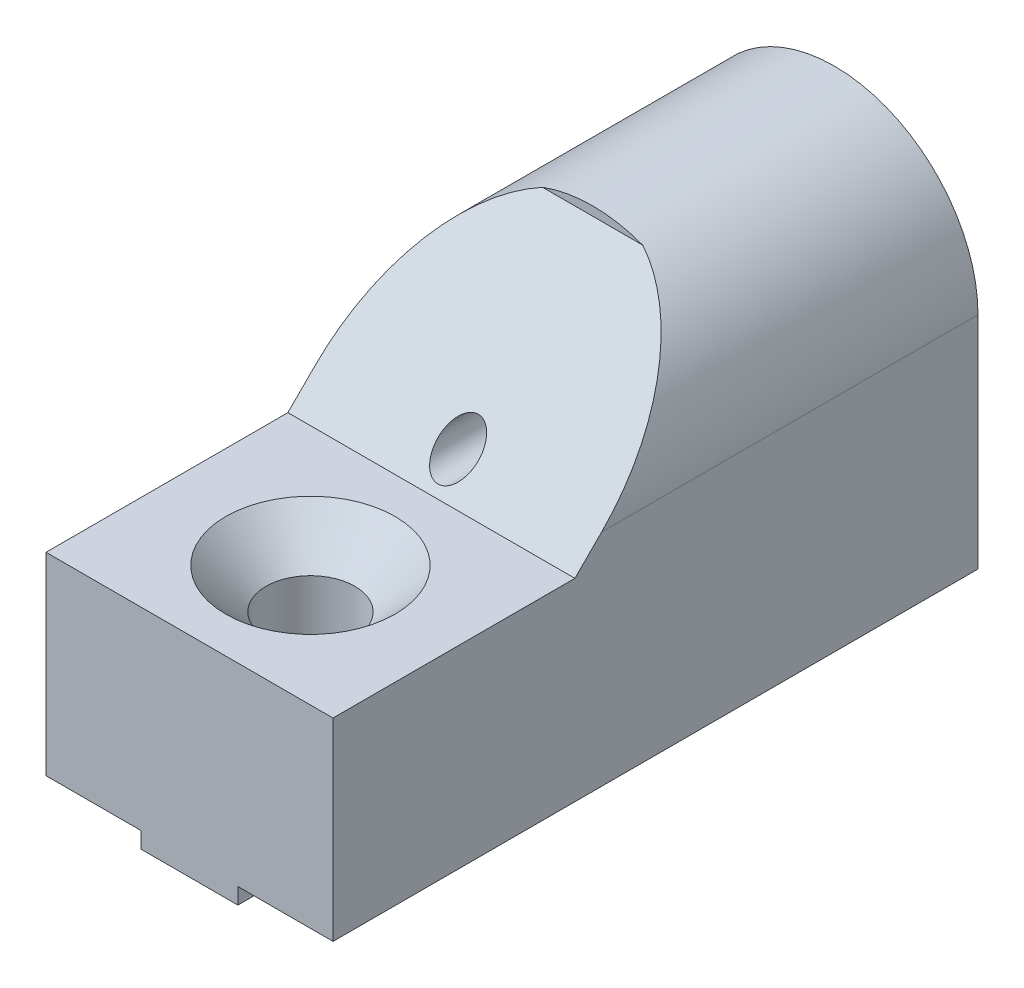
ISO-10303-21;
HEADER;
FILE_DESCRIPTION(('STEP AP214'),'2;1');
FILE_NAME('part.step','',(''),(''),'','','');
FILE_SCHEMA(('AUTOMOTIVE_DESIGN { 1 0 10303 214 1 1 1 1 }'));
ENDSEC;
DATA;
#1=APPLICATION_CONTEXT('core data for automotive mechanical design processes');
#2=APPLICATION_PROTOCOL_DEFINITION('international standard','automotive_design',2000,#1);
#3=PRODUCT_CONTEXT('',#1,'mechanical');
#4=PRODUCT('Part','Part','',(#3));
#5=PRODUCT_RELATED_PRODUCT_CATEGORY('part','',(#4));
#6=PRODUCT_DEFINITION_FORMATION('','',#4);
#7=PRODUCT_DEFINITION_CONTEXT('part definition',#1,'design');
#8=PRODUCT_DEFINITION('design','',#6,#7);
#9=PRODUCT_DEFINITION_SHAPE('','',#8);
#10=(LENGTH_UNIT() NAMED_UNIT(*) SI_UNIT(.MILLI.,.METRE.));
#11=(NAMED_UNIT(*) PLANE_ANGLE_UNIT() SI_UNIT($,.RADIAN.));
#12=(NAMED_UNIT(*) SI_UNIT($,.STERADIAN.) SOLID_ANGLE_UNIT());
#13=UNCERTAINTY_MEASURE_WITH_UNIT(LENGTH_MEASURE(1.E-05),#10,'distance_accuracy_value','');
#14=(GEOMETRIC_REPRESENTATION_CONTEXT(3) GLOBAL_UNCERTAINTY_ASSIGNED_CONTEXT((#13)) GLOBAL_UNIT_ASSIGNED_CONTEXT((#10,
#11,#12)) REPRESENTATION_CONTEXT('',''));
#15=CARTESIAN_POINT('',(0.,0.,0.));
#16=DIRECTION('',(0.,0.,1.));
#17=DIRECTION('',(1.,0.,0.));
#18=AXIS2_PLACEMENT_3D('',#15,#16,#17);
#19=CARTESIAN_POINT('',(-8.9,-13.66,15.));
#20=DIRECTION('',(0.,1.,0.));
#21=DIRECTION('',(0.,0.,1.));
#22=AXIS2_PLACEMENT_3D('',#19,#20,#21);
#23=PLANE('',#22);
#24=DIRECTION('',(0.,0.,1.));
#25=VECTOR('',#24,1.);
#26=CARTESIAN_POINT('',(3.,-13.66,40.));
#27=LINE('',#26,#25);
#28=CARTESIAN_POINT('',(3.,-13.66,0.));
#29=VERTEX_POINT('',#28);
#30=CARTESIAN_POINT('',(3.,-13.66,40.));
#31=VERTEX_POINT('',#30);
#32=EDGE_CURVE('E152',#29,#31,#27,.T.);
#33=ORIENTED_EDGE('',*,*,#32,.F.);
#34=DIRECTION('',(1.,0.,0.));
#35=VECTOR('',#34,1.);
#36=CARTESIAN_POINT('',(-8.9,-13.66,0.));
#37=LINE('',#36,#35);
#38=CARTESIAN_POINT('',(8.9,-13.66,0.));
#39=VERTEX_POINT('',#38);
#40=EDGE_CURVE('E195',#29,#39,#37,.T.);
#41=ORIENTED_EDGE('',*,*,#40,.T.);
#42=DIRECTION('',(0.,0.,-1.));
#43=VECTOR('',#42,1.);
#44=CARTESIAN_POINT('',(8.9,-13.66,15.));
#45=LINE('',#44,#43);
#46=CARTESIAN_POINT('',(8.9,-13.66,40.));
#47=VERTEX_POINT('',#46);
#48=EDGE_CURVE('E211',#47,#39,#45,.T.);
#49=ORIENTED_EDGE('',*,*,#48,.F.);
#50=DIRECTION('',(1.,0.,0.));
#51=VECTOR('',#50,1.);
#52=CARTESIAN_POINT('',(-8.9,-13.66,40.));
#53=LINE('',#52,#51);
#54=EDGE_CURVE('E58',#31,#47,#53,.T.);
#55=ORIENTED_EDGE('',*,*,#54,.F.);
#56=EDGE_LOOP('',(#33,#41,#49,#55));
#57=FACE_BOUND('',#56,.T.);
#58=ADVANCED_FACE('F41',(#57),#23,.F.);
#59=DIRECTION('',(0.,0.,-1.));
#60=VECTOR('',#59,1.);
#61=CARTESIAN_POINT('',(-3.,-13.66,40.));
#62=LINE('',#61,#60);
#63=CARTESIAN_POINT('',(-3.,-13.66,40.));
#64=VERTEX_POINT('',#63);
#65=CARTESIAN_POINT('',(-3.,-13.66,0.));
#66=VERTEX_POINT('',#65);
#67=EDGE_CURVE('E66',#64,#66,#62,.T.);
#68=ORIENTED_EDGE('',*,*,#67,.F.);
#69=CARTESIAN_POINT('',(-8.9,-13.66,40.));
#70=VERTEX_POINT('',#69);
#71=EDGE_CURVE('E163',#70,#64,#53,.T.);
#72=ORIENTED_EDGE('',*,*,#71,.F.);
#73=DIRECTION('',(0.,0.,-1.));
#74=VECTOR('',#73,1.);
#75=CARTESIAN_POINT('',(-8.9,-13.66,15.));
#76=LINE('',#75,#74);
#77=CARTESIAN_POINT('',(-8.9,-13.66,0.));
#78=VERTEX_POINT('',#77);
#79=EDGE_CURVE('E215',#70,#78,#76,.T.);
#80=ORIENTED_EDGE('',*,*,#79,.T.);
#81=EDGE_CURVE('E196',#78,#66,#37,.T.);
#82=ORIENTED_EDGE('',*,*,#81,.T.);
#83=EDGE_LOOP('',(#68,#72,#80,#82));
#84=FACE_BOUND('',#83,.T.);
#85=ADVANCED_FACE('F260',(#84),#23,.F.);
#86=CARTESIAN_POINT('',(0.,0.,15.));
#87=DIRECTION('',(0.,0.,-1.));
#88=DIRECTION('',(-1.,0.,0.));
#89=AXIS2_PLACEMENT_3D('',#86,#87,#88);
#90=PLANE('',#89);
#91=CARTESIAN_POINT('',(0.,0.,15.));
#92=DIRECTION('',(0.,0.,1.));
#93=DIRECTION('',(-1.,0.,0.));
#94=AXIS2_PLACEMENT_3D('',#91,#92,#93);
#95=CIRCLE('',#94,8.9);
#96=CARTESIAN_POINT('',(3.10715303775024,8.33999999999997,15.));
#97=VERTEX_POINT('',#96);
#98=CARTESIAN_POINT('',(-3.10715303775024,8.33999999999997,15.));
#99=VERTEX_POINT('',#98);
#100=EDGE_CURVE('E185',#97,#99,#95,.T.);
#101=ORIENTED_EDGE('',*,*,#100,.T.);
#102=DIRECTION('',(1.,0.,0.));
#103=VECTOR('',#102,1.);
#104=CARTESIAN_POINT('',(8.9,8.33999999999997,15.));
#105=LINE('',#104,#103);
#106=EDGE_CURVE('E223',#99,#97,#105,.T.);
#107=ORIENTED_EDGE('',*,*,#106,.T.);
#108=EDGE_LOOP('',(#101,#107));
#109=FACE_BOUND('',#108,.T.);
#110=ADVANCED_FACE('F265',(#109),#90,.F.);
#111=CARTESIAN_POINT('',(0.,0.,0.));
#112=DIRECTION('',(0.,0.,-1.));
#113=DIRECTION('',(-1.,0.,0.));
#114=AXIS2_PLACEMENT_3D('',#111,#112,#113);
#115=PLANE('',#114);
#116=DIRECTION('',(0.,-1.,0.));
#117=VECTOR('',#116,1.);
#118=CARTESIAN_POINT('',(-8.9,-13.66,0.));
#119=LINE('',#118,#117);
#120=CARTESIAN_POINT('',(-8.9,0.,0.));
#121=VERTEX_POINT('',#120);
#122=EDGE_CURVE('E191',#121,#78,#119,.T.);
#123=ORIENTED_EDGE('',*,*,#122,.F.);
#124=CARTESIAN_POINT('',(0.,0.,0.));
#125=DIRECTION('',(0.,0.,1.));
#126=DIRECTION('',(-1.,0.,0.));
#127=AXIS2_PLACEMENT_3D('',#124,#125,#126);
#128=CIRCLE('',#127,8.9);
#129=CARTESIAN_POINT('',(8.9,0.,0.));
#130=VERTEX_POINT('',#129);
#131=EDGE_CURVE('E190',#130,#121,#128,.T.);
#132=ORIENTED_EDGE('',*,*,#131,.F.);
#133=DIRECTION('',(0.,1.,0.));
#134=VECTOR('',#133,1.);
#135=CARTESIAN_POINT('',(8.9,0.,0.));
#136=LINE('',#135,#134);
#137=EDGE_CURVE('E199',#39,#130,#136,.T.);
#138=ORIENTED_EDGE('',*,*,#137,.F.);
#139=ORIENTED_EDGE('',*,*,#40,.F.);
#140=DIRECTION('',(0.,1.,0.));
#141=VECTOR('',#140,1.);
#142=CARTESIAN_POINT('',(3.,-14.66,0.));
#143=LINE('',#142,#141);
#144=CARTESIAN_POINT('',(3.,-14.66,0.));
#145=VERTEX_POINT('',#144);
#146=EDGE_CURVE('E326',#145,#29,#143,.T.);
#147=ORIENTED_EDGE('',*,*,#146,.F.);
#148=DIRECTION('',(1.,0.,0.));
#149=VECTOR('',#148,1.);
#150=CARTESIAN_POINT('',(3.,-14.66,0.));
#151=LINE('',#150,#149);
#152=CARTESIAN_POINT('',(-3.,-14.66,0.));
#153=VERTEX_POINT('',#152);
#154=EDGE_CURVE('E145',#153,#145,#151,.T.);
#155=ORIENTED_EDGE('',*,*,#154,.F.);
#156=DIRECTION('',(0.,1.,0.));
#157=VECTOR('',#156,1.);
#158=CARTESIAN_POINT('',(-3.,-14.66,0.));
#159=LINE('',#158,#157);
#160=EDGE_CURVE('E159',#153,#66,#159,.T.);
#161=ORIENTED_EDGE('',*,*,#160,.T.);
#162=ORIENTED_EDGE('',*,*,#81,.F.);
#163=EDGE_LOOP('',(#123,#132,#138,#139,#147,#155,#161,#162));
#164=FACE_BOUND('',#163,.T.);
#165=CARTESIAN_POINT('',(0.,0.,0.));
#166=DIRECTION('',(0.,0.,1.));
#167=DIRECTION('',(1.,0.,0.));
#168=AXIS2_PLACEMENT_3D('',#165,#166,#167);
#169=CIRCLE('',#168,1.25);
#170=CARTESIAN_POINT('',(1.25,0.,0.));
#171=VERTEX_POINT('',#170);
#172=EDGE_CURVE('E180',#171,#171,#169,.T.);
#173=ORIENTED_EDGE('',*,*,#172,.T.);
#174=EDGE_LOOP('',(#173));
#175=FACE_BOUND('',#174,.T.);
#176=ADVANCED_FACE('F272',(#164,#175),#115,.T.);
#177=CARTESIAN_POINT('',(-8.9,-13.66,15.));
#178=DIRECTION('',(1.,0.,0.));
#179=DIRECTION('',(0.,0.,-1.));
#180=AXIS2_PLACEMENT_3D('',#177,#178,#179);
#181=PLANE('',#180);
#182=ORIENTED_EDGE('',*,*,#122,.T.);
#183=ORIENTED_EDGE('',*,*,#79,.F.);
#184=DIRECTION('',(0.,-1.,0.));
#185=VECTOR('',#184,1.);
#186=CARTESIAN_POINT('',(-8.9,-13.66,40.));
#187=LINE('',#186,#185);
#188=CARTESIAN_POINT('',(-8.9,-1.66,40.));
#189=VERTEX_POINT('',#188);
#190=EDGE_CURVE('E154',#189,#70,#187,.T.);
#191=ORIENTED_EDGE('',*,*,#190,.F.);
#192=DIRECTION('',(0.,0.,-1.));
#193=VECTOR('',#192,1.);
#194=CARTESIAN_POINT('',(-8.9,-1.66,40.));
#195=LINE('',#194,#193);
#196=CARTESIAN_POINT('',(-8.9,-1.66,25.0000000000001));
#197=VERTEX_POINT('',#196);
#198=EDGE_CURVE('E172',#189,#197,#195,.T.);
#199=ORIENTED_EDGE('',*,*,#198,.T.);
#200=DIRECTION('',(0.,-0.707106781186544,0.707106781186551));
#201=VECTOR('',#200,1.);
#202=CARTESIAN_POINT('',(-8.9,-2.6599999999999,26.));
#203=LINE('',#202,#201);
#204=CARTESIAN_POINT('',(-8.9,0.,23.3400000000001));
#205=VERTEX_POINT('',#204);
#206=EDGE_CURVE('E226',#197,#205,#203,.F.);
#207=ORIENTED_EDGE('',*,*,#206,.T.);
#208=DIRECTION('',(0.,0.,-1.));
#209=VECTOR('',#208,1.);
#210=CARTESIAN_POINT('',(-8.9,0.,15.));
#211=LINE('',#210,#209);
#212=EDGE_CURVE('E189',#205,#121,#211,.T.);
#213=ORIENTED_EDGE('',*,*,#212,.T.);
#214=EDGE_LOOP('',(#182,#183,#191,#199,#207,#213));
#215=FACE_BOUND('',#214,.T.);
#216=ADVANCED_FACE('F270',(#215),#181,.F.);
#217=CARTESIAN_POINT('',(8.9,0.,15.));
#218=DIRECTION('',(-1.,0.,0.));
#219=DIRECTION('',(0.,-1.,0.));
#220=AXIS2_PLACEMENT_3D('',#217,#218,#219);
#221=PLANE('',#220);
#222=ORIENTED_EDGE('',*,*,#137,.T.);
#223=DIRECTION('',(0.,0.,-1.));
#224=VECTOR('',#223,1.);
#225=CARTESIAN_POINT('',(8.9,0.,15.));
#226=LINE('',#225,#224);
#227=CARTESIAN_POINT('',(8.9,0.,23.3400000000001));
#228=VERTEX_POINT('',#227);
#229=EDGE_CURVE('E207',#228,#130,#226,.T.);
#230=ORIENTED_EDGE('',*,*,#229,.F.);
#231=DIRECTION('',(0.,0.707106781186544,-0.707106781186551));
#232=VECTOR('',#231,1.);
#233=CARTESIAN_POINT('',(8.9,4.17000000000003,19.17));
#234=LINE('',#233,#232);
#235=CARTESIAN_POINT('',(8.9,-1.66,25.0000000000001));
#236=VERTEX_POINT('',#235);
#237=EDGE_CURVE('E237',#228,#236,#234,.F.);
#238=ORIENTED_EDGE('',*,*,#237,.T.);
#239=DIRECTION('',(0.,0.,-1.));
#240=VECTOR('',#239,1.);
#241=CARTESIAN_POINT('',(8.9,-1.66,40.));
#242=LINE('',#241,#240);
#243=CARTESIAN_POINT('',(8.9,-1.66,40.));
#244=VERTEX_POINT('',#243);
#245=EDGE_CURVE('E176',#244,#236,#242,.T.);
#246=ORIENTED_EDGE('',*,*,#245,.F.);
#247=DIRECTION('',(0.,1.,0.));
#248=VECTOR('',#247,1.);
#249=CARTESIAN_POINT('',(8.9,-13.66,40.));
#250=LINE('',#249,#248);
#251=EDGE_CURVE('E166',#47,#244,#250,.T.);
#252=ORIENTED_EDGE('',*,*,#251,.F.);
#253=ORIENTED_EDGE('',*,*,#48,.T.);
#254=EDGE_LOOP('',(#222,#230,#238,#246,#252,#253));
#255=FACE_BOUND('',#254,.T.);
#256=ADVANCED_FACE('F268',(#255),#221,.F.);
#257=CARTESIAN_POINT('',(0.,0.,15.));
#258=DIRECTION('',(0.,0.,-1.));
#259=DIRECTION('',(-1.,0.,0.));
#260=AXIS2_PLACEMENT_3D('',#257,#258,#259);
#261=CYLINDRICAL_SURFACE('',#260,8.9);
#262=ORIENTED_EDGE('',*,*,#131,.T.);
#263=ORIENTED_EDGE('',*,*,#212,.F.);
#264=CARTESIAN_POINT('',(0.,0.,23.3400000000001));
#265=DIRECTION('',(0.,0.707106781186551,0.707106781186544));
#266=DIRECTION('',(0.,0.707106781186544,-0.707106781186551));
#267=AXIS2_PLACEMENT_3D('',#264,#265,#266);
#268=ELLIPSE('',#267,12.5865007051206,8.9);
#269=EDGE_CURVE('E230',#205,#99,#268,.F.);
#270=ORIENTED_EDGE('',*,*,#269,.T.);
#271=ORIENTED_EDGE('',*,*,#100,.F.);
#272=CARTESIAN_POINT('',(0.,0.,23.3400000000001));
#273=DIRECTION('',(0.,0.707106781186551,0.707106781186544));
#274=DIRECTION('',(0.,0.707106781186544,-0.707106781186551));
#275=AXIS2_PLACEMENT_3D('',#272,#273,#274);
#276=ELLIPSE('',#275,12.5865007051206,8.9);
#277=EDGE_CURVE('E233',#97,#228,#276,.F.);
#278=ORIENTED_EDGE('',*,*,#277,.T.);
#279=ORIENTED_EDGE('',*,*,#229,.T.);
#280=EDGE_LOOP('',(#262,#263,#270,#271,#278,#279));
#281=FACE_BOUND('',#280,.T.);
#282=ADVANCED_FACE('F293',(#281),#261,.T.);
#283=CARTESIAN_POINT('',(0.,0.,15.));
#284=DIRECTION('',(0.,0.,-1.));
#285=DIRECTION('',(-1.,0.,0.));
#286=AXIS2_PLACEMENT_3D('',#283,#284,#285);
#287=CYLINDRICAL_SURFACE('',#286,1.25);
#288=CARTESIAN_POINT('',(0.,0.,23.3400000000001));
#289=DIRECTION('',(0.,0.707106781186551,0.707106781186544));
#290=DIRECTION('',(0.,0.707106781186544,-0.707106781186551));
#291=AXIS2_PLACEMENT_3D('',#288,#289,#290);
#292=ELLIPSE('',#291,1.76776695296638,1.25);
#293=CARTESIAN_POINT('',(0.,1.25,22.09));
#294=VERTEX_POINT('',#293);
#295=EDGE_CURVE('E184',#294,#294,#292,.T.);
#296=ORIENTED_EDGE('',*,*,#295,.T.);
#297=EDGE_LOOP('',(#296));
#298=FACE_BOUND('',#297,.T.);
#299=ORIENTED_EDGE('',*,*,#172,.F.);
#300=EDGE_LOOP('',(#299));
#301=FACE_BOUND('',#300,.T.);
#302=ADVANCED_FACE('F290',(#298,#301),#287,.F.);
#303=CARTESIAN_POINT('',(-8.9,-1.66,40.));
#304=DIRECTION('',(0.,-1.,0.));
#305=DIRECTION('',(0.,0.,-1.));
#306=AXIS2_PLACEMENT_3D('',#303,#304,#305);
#307=PLANE('',#306);
#308=CARTESIAN_POINT('',(0.,-1.66,32.5000000000001));
#309=DIRECTION('',(0.,-1.,0.));
#310=DIRECTION('',(0.,0.,-1.));
#311=AXIS2_PLACEMENT_3D('',#308,#309,#310);
#312=CIRCLE('',#311,5.25000000000002);
#313=CARTESIAN_POINT('',(0.,-1.66,27.2500000000001));
#314=VERTEX_POINT('',#313);
#315=EDGE_CURVE('E11',#314,#314,#312,.T.);
#316=ORIENTED_EDGE('',*,*,#315,.T.);
#317=EDGE_LOOP('',(#316));
#318=FACE_BOUND('',#317,.T.);
#319=ORIENTED_EDGE('',*,*,#245,.T.);
#320=DIRECTION('',(-1.,0.,0.));
#321=VECTOR('',#320,1.);
#322=CARTESIAN_POINT('',(-8.9,-1.66,25.0000000000001));
#323=LINE('',#322,#321);
#324=EDGE_CURVE('E219',#236,#197,#323,.T.);
#325=ORIENTED_EDGE('',*,*,#324,.T.);
#326=ORIENTED_EDGE('',*,*,#198,.F.);
#327=DIRECTION('',(-1.,0.,0.));
#328=VECTOR('',#327,1.);
#329=CARTESIAN_POINT('',(-8.9,-1.66,40.));
#330=LINE('',#329,#328);
#331=EDGE_CURVE('E169',#244,#189,#330,.T.);
#332=ORIENTED_EDGE('',*,*,#331,.F.);
#333=EDGE_LOOP('',(#319,#325,#326,#332));
#334=FACE_BOUND('',#333,.T.);
#335=ADVANCED_FACE('F282',(#318,#334),#307,.F.);
#336=CARTESIAN_POINT('',(0.,0.,40.));
#337=DIRECTION('',(0.,0.,-1.));
#338=DIRECTION('',(-1.,0.,0.));
#339=AXIS2_PLACEMENT_3D('',#336,#337,#338);
#340=PLANE('',#339);
#341=ORIENTED_EDGE('',*,*,#190,.T.);
#342=ORIENTED_EDGE('',*,*,#71,.T.);
#343=DIRECTION('',(0.,1.,0.));
#344=VECTOR('',#343,1.);
#345=CARTESIAN_POINT('',(-3.,-14.66,40.));
#346=LINE('',#345,#344);
#347=CARTESIAN_POINT('',(-3.,-14.66,40.));
#348=VERTEX_POINT('',#347);
#349=EDGE_CURVE('E134',#348,#64,#346,.T.);
#350=ORIENTED_EDGE('',*,*,#349,.F.);
#351=DIRECTION('',(-1.,0.,0.));
#352=VECTOR('',#351,1.);
#353=CARTESIAN_POINT('',(3.,-14.66,40.));
#354=LINE('',#353,#352);
#355=CARTESIAN_POINT('',(3.,-14.66,40.));
#356=VERTEX_POINT('',#355);
#357=EDGE_CURVE('E126',#356,#348,#354,.T.);
#358=ORIENTED_EDGE('',*,*,#357,.F.);
#359=DIRECTION('',(0.,1.,0.));
#360=VECTOR('',#359,1.);
#361=CARTESIAN_POINT('',(3.,-14.66,40.));
#362=LINE('',#361,#360);
#363=EDGE_CURVE('E131',#356,#31,#362,.T.);
#364=ORIENTED_EDGE('',*,*,#363,.T.);
#365=ORIENTED_EDGE('',*,*,#54,.T.);
#366=ORIENTED_EDGE('',*,*,#251,.T.);
#367=ORIENTED_EDGE('',*,*,#331,.T.);
#368=EDGE_LOOP('',(#341,#342,#350,#358,#364,#365,#366,#367));
#369=FACE_BOUND('',#368,.T.);
#370=ADVANCED_FACE('F129',(#369),#340,.F.);
#371=CARTESIAN_POINT('',(-8.9,-1.66,25.0000000000001));
#372=DIRECTION('',(0.,0.707106781186551,0.707106781186544));
#373=DIRECTION('',(1.,0.,0.));
#374=AXIS2_PLACEMENT_3D('',#371,#372,#373);
#375=PLANE('',#374);
#376=ORIENTED_EDGE('',*,*,#277,.F.);
#377=ORIENTED_EDGE('',*,*,#106,.F.);
#378=ORIENTED_EDGE('',*,*,#269,.F.);
#379=ORIENTED_EDGE('',*,*,#206,.F.);
#380=ORIENTED_EDGE('',*,*,#324,.F.);
#381=ORIENTED_EDGE('',*,*,#237,.F.);
#382=EDGE_LOOP('',(#376,#377,#378,#379,#380,#381));
#383=FACE_BOUND('',#382,.T.);
#384=ORIENTED_EDGE('',*,*,#295,.F.);
#385=EDGE_LOOP('',(#384));
#386=FACE_BOUND('',#385,.T.);
#387=ADVANCED_FACE('F256',(#383,#386),#375,.T.);
#388=CARTESIAN_POINT('',(0.,-13.66,32.5000000000001));
#389=DIRECTION('',(0.,1.,0.));
#390=DIRECTION('',(0.,0.,1.));
#391=AXIS2_PLACEMENT_3D('',#388,#389,#390);
#392=CYLINDRICAL_SURFACE('',#391,2.75);
#393=CARTESIAN_POINT('',(0.,-4.16000000000001,32.5000000000001));
#394=DIRECTION('',(0.,-1.,0.));
#395=DIRECTION('',(0.,0.,-1.));
#396=AXIS2_PLACEMENT_3D('',#393,#394,#395);
#397=CIRCLE('',#396,2.75);
#398=CARTESIAN_POINT('',(0.,-4.16000000000001,29.7500000000001));
#399=VERTEX_POINT('',#398);
#400=EDGE_CURVE('E51',#399,#399,#397,.F.);
#401=ORIENTED_EDGE('',*,*,#400,.T.);
#402=EDGE_LOOP('',(#401));
#403=FACE_BOUND('',#402,.T.);
#404=CARTESIAN_POINT('',(0.,-14.66,32.5000000000001));
#405=DIRECTION('',(0.,-1.,0.));
#406=DIRECTION('',(0.,0.,-1.));
#407=AXIS2_PLACEMENT_3D('',#404,#405,#406);
#408=CIRCLE('',#407,2.75);
#409=CARTESIAN_POINT('',(0.,-14.66,29.7500000000001));
#410=VERTEX_POINT('',#409);
#411=EDGE_CURVE('E337',#410,#410,#408,.T.);
#412=ORIENTED_EDGE('',*,*,#411,.T.);
#413=EDGE_LOOP('',(#412));
#414=FACE_BOUND('',#413,.T.);
#415=ADVANCED_FACE('F246',(#403,#414),#392,.F.);
#416=CARTESIAN_POINT('',(0.,-4.16000000000001,32.5000000000001));
#417=DIRECTION('',(0.,1.,0.));
#418=DIRECTION('',(0.,0.,1.));
#419=AXIS2_PLACEMENT_3D('',#416,#417,#418);
#420=CONICAL_SURFACE('',#419,2.75,0.78539816339745);
#421=ORIENTED_EDGE('',*,*,#315,.F.);
#422=EDGE_LOOP('',(#421));
#423=FACE_BOUND('',#422,.T.);
#424=ORIENTED_EDGE('',*,*,#400,.F.);
#425=EDGE_LOOP('',(#424));
#426=FACE_BOUND('',#425,.T.);
#427=ADVANCED_FACE('F44',(#423,#426),#420,.F.);
#428=CARTESIAN_POINT('',(0.,-14.66,0.));
#429=DIRECTION('',(0.,1.,0.));
#430=DIRECTION('',(0.,0.,1.));
#431=AXIS2_PLACEMENT_3D('',#428,#429,#430);
#432=PLANE('',#431);
#433=DIRECTION('',(0.,0.,1.));
#434=VECTOR('',#433,1.);
#435=CARTESIAN_POINT('',(3.,-14.66,40.));
#436=LINE('',#435,#434);
#437=EDGE_CURVE('E139',#145,#356,#436,.T.);
#438=ORIENTED_EDGE('',*,*,#437,.T.);
#439=ORIENTED_EDGE('',*,*,#357,.T.);
#440=DIRECTION('',(0.,0.,-1.));
#441=VECTOR('',#440,1.);
#442=CARTESIAN_POINT('',(-3.,-14.66,40.));
#443=LINE('',#442,#441);
#444=EDGE_CURVE('E138',#348,#153,#443,.T.);
#445=ORIENTED_EDGE('',*,*,#444,.T.);
#446=ORIENTED_EDGE('',*,*,#154,.T.);
#447=EDGE_LOOP('',(#438,#439,#445,#446));
#448=FACE_BOUND('',#447,.T.);
#449=ORIENTED_EDGE('',*,*,#411,.F.);
#450=EDGE_LOOP('',(#449));
#451=FACE_BOUND('',#450,.T.);
#452=ADVANCED_FACE('F142',(#448,#451),#432,.F.);
#453=CARTESIAN_POINT('',(3.,-14.66,40.));
#454=DIRECTION('',(-1.,0.,0.));
#455=DIRECTION('',(0.,0.,1.));
#456=AXIS2_PLACEMENT_3D('',#453,#454,#455);
#457=PLANE('',#456);
#458=ORIENTED_EDGE('',*,*,#32,.T.);
#459=ORIENTED_EDGE('',*,*,#363,.F.);
#460=ORIENTED_EDGE('',*,*,#437,.F.);
#461=ORIENTED_EDGE('',*,*,#146,.T.);
#462=EDGE_LOOP('',(#458,#459,#460,#461));
#463=FACE_BOUND('',#462,.T.);
#464=ADVANCED_FACE('F151',(#463),#457,.F.);
#465=CARTESIAN_POINT('',(-3.,-14.66,40.));
#466=DIRECTION('',(1.,0.,0.));
#467=DIRECTION('',(0.,0.,-1.));
#468=AXIS2_PLACEMENT_3D('',#465,#466,#467);
#469=PLANE('',#468);
#470=ORIENTED_EDGE('',*,*,#67,.T.);
#471=ORIENTED_EDGE('',*,*,#160,.F.);
#472=ORIENTED_EDGE('',*,*,#444,.F.);
#473=ORIENTED_EDGE('',*,*,#349,.T.);
#474=EDGE_LOOP('',(#470,#471,#472,#473));
#475=FACE_BOUND('',#474,.T.);
#476=ADVANCED_FACE('F345',(#475),#469,.F.);
#477=CLOSED_SHELL('',(#58,#85,#110,#176,#216,#256,#282,#302,#335,#370,#387,#415,#427,#452,#464,#476));
#478=MANIFOLD_SOLID_BREP('B2',#477);
#479=ADVANCED_BREP_SHAPE_REPRESENTATION('',(#18,#478),#14);
#480=SHAPE_DEFINITION_REPRESENTATION(#9,#479);
ENDSEC;
END-ISO-10303-21;
